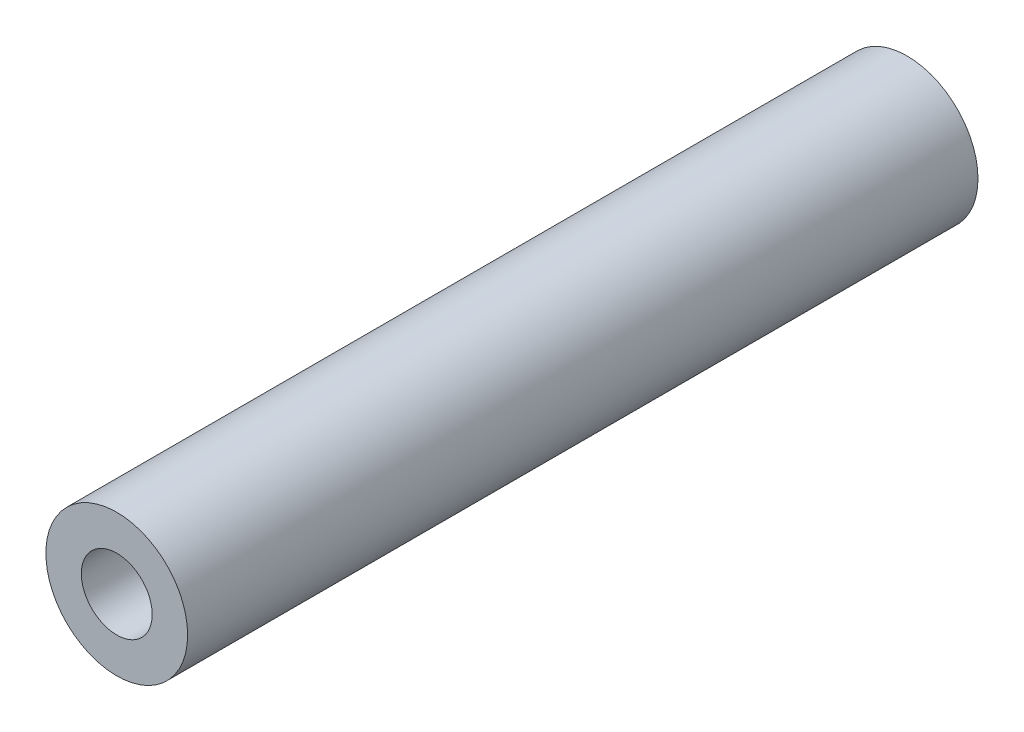
ISO-10303-21;
HEADER;
FILE_DESCRIPTION(('STEP AP214'),'2;1');
FILE_NAME('part.step','',(''),(''),'','','');
FILE_SCHEMA(('AUTOMOTIVE_DESIGN { 1 0 10303 214 1 1 1 1 }'));
ENDSEC;
DATA;
#1=APPLICATION_CONTEXT('core data for automotive mechanical design processes');
#2=APPLICATION_PROTOCOL_DEFINITION('international standard','automotive_design',2000,#1);
#3=PRODUCT_CONTEXT('',#1,'mechanical');
#4=PRODUCT('Part','Part','',(#3));
#5=PRODUCT_RELATED_PRODUCT_CATEGORY('part','',(#4));
#6=PRODUCT_DEFINITION_FORMATION('','',#4);
#7=PRODUCT_DEFINITION_CONTEXT('part definition',#1,'design');
#8=PRODUCT_DEFINITION('design','',#6,#7);
#9=PRODUCT_DEFINITION_SHAPE('','',#8);
#10=(LENGTH_UNIT() NAMED_UNIT(*) SI_UNIT(.MILLI.,.METRE.));
#11=(NAMED_UNIT(*) PLANE_ANGLE_UNIT() SI_UNIT($,.RADIAN.));
#12=(NAMED_UNIT(*) SI_UNIT($,.STERADIAN.) SOLID_ANGLE_UNIT());
#13=UNCERTAINTY_MEASURE_WITH_UNIT(LENGTH_MEASURE(1.E-05),#10,'distance_accuracy_value','');
#14=(GEOMETRIC_REPRESENTATION_CONTEXT(3) GLOBAL_UNCERTAINTY_ASSIGNED_CONTEXT((#13)) GLOBAL_UNIT_ASSIGNED_CONTEXT((#10,
#11,#12)) REPRESENTATION_CONTEXT('',''));
#15=CARTESIAN_POINT('',(0.,0.,0.));
#16=DIRECTION('',(0.,0.,1.));
#17=DIRECTION('',(1.,0.,0.));
#18=AXIS2_PLACEMENT_3D('',#15,#16,#17);
#19=CARTESIAN_POINT('',(0.,0.,44.6));
#20=DIRECTION('',(0.,0.,1.));
#21=DIRECTION('',(1.,0.,0.));
#22=AXIS2_PLACEMENT_3D('',#19,#20,#21);
#23=PLANE('',#22);
#24=CARTESIAN_POINT('',(0.,0.,44.6));
#25=DIRECTION('',(0.,0.,1.));
#26=DIRECTION('',(1.,0.,0.));
#27=AXIS2_PLACEMENT_3D('',#24,#25,#26);
#28=CIRCLE('',#27,4.);
#29=CARTESIAN_POINT('',(4.,0.,44.6));
#30=VERTEX_POINT('',#29);
#31=EDGE_CURVE('E10',#30,#30,#28,.T.);
#32=ORIENTED_EDGE('',*,*,#31,.T.);
#33=EDGE_LOOP('',(#32));
#34=FACE_BOUND('',#33,.T.);
#35=CARTESIAN_POINT('',(0.,0.,44.6));
#36=DIRECTION('',(0.,0.,1.));
#37=DIRECTION('',(1.,0.,0.));
#38=AXIS2_PLACEMENT_3D('',#35,#36,#37);
#39=CIRCLE('',#38,2.);
#40=CARTESIAN_POINT('',(2.,0.,44.6));
#41=VERTEX_POINT('',#40);
#42=EDGE_CURVE('E41',#41,#41,#39,.T.);
#43=ORIENTED_EDGE('',*,*,#42,.F.);
#44=EDGE_LOOP('',(#43));
#45=FACE_BOUND('',#44,.T.);
#46=ADVANCED_FACE('F30',(#34,#45),#23,.T.);
#47=CARTESIAN_POINT('',(0.,0.,0.));
#48=DIRECTION('',(0.,0.,1.));
#49=DIRECTION('',(1.,0.,0.));
#50=AXIS2_PLACEMENT_3D('',#47,#48,#49);
#51=PLANE('',#50);
#52=CARTESIAN_POINT('',(0.,0.,0.));
#53=DIRECTION('',(0.,0.,1.));
#54=DIRECTION('',(1.,0.,0.));
#55=AXIS2_PLACEMENT_3D('',#52,#53,#54);
#56=CIRCLE('',#55,4.);
#57=CARTESIAN_POINT('',(4.,0.,0.));
#58=VERTEX_POINT('',#57);
#59=EDGE_CURVE('E34',#58,#58,#56,.T.);
#60=ORIENTED_EDGE('',*,*,#59,.F.);
#61=EDGE_LOOP('',(#60));
#62=FACE_BOUND('',#61,.T.);
#63=CARTESIAN_POINT('',(0.,0.,0.));
#64=DIRECTION('',(0.,0.,1.));
#65=DIRECTION('',(1.,0.,0.));
#66=AXIS2_PLACEMENT_3D('',#63,#64,#65);
#67=CIRCLE('',#66,2.);
#68=CARTESIAN_POINT('',(2.,0.,0.));
#69=VERTEX_POINT('',#68);
#70=EDGE_CURVE('E43',#69,#69,#67,.T.);
#71=ORIENTED_EDGE('',*,*,#70,.T.);
#72=EDGE_LOOP('',(#71));
#73=FACE_BOUND('',#72,.T.);
#74=ADVANCED_FACE('F53',(#62,#73),#51,.F.);
#75=CARTESIAN_POINT('',(0.,0.,44.6));
#76=DIRECTION('',(0.,0.,-1.));
#77=DIRECTION('',(-1.,0.,0.));
#78=AXIS2_PLACEMENT_3D('',#75,#76,#77);
#79=CYLINDRICAL_SURFACE('',#78,4.);
#80=ORIENTED_EDGE('',*,*,#31,.F.);
#81=EDGE_LOOP('',(#80));
#82=FACE_BOUND('',#81,.T.);
#83=ORIENTED_EDGE('',*,*,#59,.T.);
#84=EDGE_LOOP('',(#83));
#85=FACE_BOUND('',#84,.T.);
#86=ADVANCED_FACE('F32',(#82,#85),#79,.T.);
#87=CARTESIAN_POINT('',(0.,0.,44.6));
#88=DIRECTION('',(0.,0.,-1.));
#89=DIRECTION('',(-1.,0.,0.));
#90=AXIS2_PLACEMENT_3D('',#87,#88,#89);
#91=CYLINDRICAL_SURFACE('',#90,2.);
#92=ORIENTED_EDGE('',*,*,#42,.T.);
#93=EDGE_LOOP('',(#92));
#94=FACE_BOUND('',#93,.T.);
#95=ORIENTED_EDGE('',*,*,#70,.F.);
#96=EDGE_LOOP('',(#95));
#97=FACE_BOUND('',#96,.T.);
#98=ADVANCED_FACE('F49',(#94,#97),#91,.F.);
#99=CLOSED_SHELL('',(#46,#74,#86,#98));
#100=MANIFOLD_SOLID_BREP('B2',#99);
#101=ADVANCED_BREP_SHAPE_REPRESENTATION('',(#18,#100),#14);
#102=SHAPE_DEFINITION_REPRESENTATION(#9,#101);
ENDSEC;
END-ISO-10303-21;
